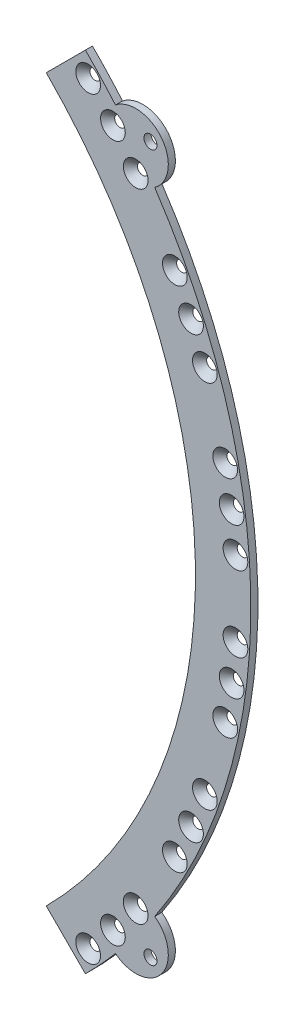
ISO-10303-21;
HEADER;
FILE_DESCRIPTION(('STEP AP214'),'2;1');
FILE_NAME('part.step','',(''),(''),'','','');
FILE_SCHEMA(('AUTOMOTIVE_DESIGN { 1 0 10303 214 1 1 1 1 }'));
ENDSEC;
DATA;
#1=APPLICATION_CONTEXT('core data for automotive mechanical design processes');
#2=APPLICATION_PROTOCOL_DEFINITION('international standard','automotive_design',2000,#1);
#3=PRODUCT_CONTEXT('',#1,'mechanical');
#4=PRODUCT('Part','Part','',(#3));
#5=PRODUCT_RELATED_PRODUCT_CATEGORY('part','',(#4));
#6=PRODUCT_DEFINITION_FORMATION('','',#4);
#7=PRODUCT_DEFINITION_CONTEXT('part definition',#1,'design');
#8=PRODUCT_DEFINITION('design','',#6,#7);
#9=PRODUCT_DEFINITION_SHAPE('','',#8);
#10=(LENGTH_UNIT() NAMED_UNIT(*) SI_UNIT(.MILLI.,.METRE.));
#11=(NAMED_UNIT(*) PLANE_ANGLE_UNIT() SI_UNIT($,.RADIAN.));
#12=(NAMED_UNIT(*) SI_UNIT($,.STERADIAN.) SOLID_ANGLE_UNIT());
#13=UNCERTAINTY_MEASURE_WITH_UNIT(LENGTH_MEASURE(1.E-05),#10,'distance_accuracy_value','');
#14=(GEOMETRIC_REPRESENTATION_CONTEXT(3) GLOBAL_UNCERTAINTY_ASSIGNED_CONTEXT((#13)) GLOBAL_UNIT_ASSIGNED_CONTEXT((#10,
#11,#12)) REPRESENTATION_CONTEXT('',''));
#15=CARTESIAN_POINT('',(0.,0.,0.));
#16=DIRECTION('',(0.,0.,1.));
#17=DIRECTION('',(1.,0.,0.));
#18=AXIS2_PLACEMENT_3D('',#15,#16,#17);
#19=CARTESIAN_POINT('',(0.,0.,2.));
#20=DIRECTION('',(0.,0.,-1.));
#21=DIRECTION('',(-1.,0.,0.));
#22=AXIS2_PLACEMENT_3D('',#19,#20,#21);
#23=PLANE('',#22);
#24=CARTESIAN_POINT('',(131.954619136931,-100.064346357229,2.));
#25=DIRECTION('',(0.,0.,-1.));
#26=DIRECTION('',(-1.,0.,0.));
#27=AXIS2_PLACEMENT_3D('',#24,#25,#26);
#28=CIRCLE('',#27,1.85000000000001);
#29=CARTESIAN_POINT('',(130.104619136931,-100.064346357229,2.));
#30=VERTEX_POINT('',#29);
#31=EDGE_CURVE('E235',#30,#30,#28,.T.);
#32=ORIENTED_EDGE('',*,*,#31,.T.);
#33=EDGE_LOOP('',(#32));
#34=FACE_BOUND('',#33,.T.);
#35=CARTESIAN_POINT('',(131.95461913693,100.064346357227,2.));
#36=DIRECTION('',(0.,0.,-1.));
#37=DIRECTION('',(-1.,0.,0.));
#38=AXIS2_PLACEMENT_3D('',#35,#36,#37);
#39=CIRCLE('',#38,1.85);
#40=CARTESIAN_POINT('',(130.10461913693,100.064346357227,2.));
#41=VERTEX_POINT('',#40);
#42=EDGE_CURVE('E599',#41,#41,#39,.T.);
#43=ORIENTED_EDGE('',*,*,#42,.T.);
#44=EDGE_LOOP('',(#43));
#45=FACE_BOUND('',#44,.T.);
#46=CARTESIAN_POINT('',(114.302744813103,-106.751311599393,2.));
#47=DIRECTION('',(0.,0.,-1.));
#48=DIRECTION('',(-1.,0.,0.));
#49=AXIS2_PLACEMENT_3D('',#46,#47,#48);
#50=CIRCLE('',#49,3.49999999998619);
#51=CARTESIAN_POINT('',(110.802744813116,-106.751311599393,2.));
#52=VERTEX_POINT('',#51);
#53=EDGE_CURVE('E11',#52,#52,#50,.T.);
#54=ORIENTED_EDGE('',*,*,#53,.T.);
#55=EDGE_LOOP('',(#54));
#56=FACE_BOUND('',#55,.T.);
#57=CARTESIAN_POINT('',(121.321245866172,-98.702154492594,2.));
#58=DIRECTION('',(0.,0.,-1.));
#59=DIRECTION('',(-1.,0.,0.));
#60=AXIS2_PLACEMENT_3D('',#57,#58,#59);
#61=CIRCLE('',#60,3.5);
#62=CARTESIAN_POINT('',(117.821245866172,-98.702154492594,2.));
#63=VERTEX_POINT('',#62);
#64=EDGE_CURVE('E41',#63,#63,#61,.T.);
#65=ORIENTED_EDGE('',*,*,#64,.T.);
#66=EDGE_LOOP('',(#65));
#67=FACE_BOUND('',#66,.T.);
#68=CARTESIAN_POINT('',(127.774091266831,-90.1928023787678,2.));
#69=DIRECTION('',(0.,0.,-1.));
#70=DIRECTION('',(-1.,0.,0.));
#71=AXIS2_PLACEMENT_3D('',#68,#69,#70);
#72=CIRCLE('',#71,3.50000000000325);
#73=CARTESIAN_POINT('',(124.274091266828,-90.1928023787678,2.));
#74=VERTEX_POINT('',#73);
#75=EDGE_CURVE('E185',#74,#74,#72,.T.);
#76=ORIENTED_EDGE('',*,*,#75,.T.);
#77=EDGE_LOOP('',(#76));
#78=FACE_BOUND('',#77,.T.);
#79=CARTESIAN_POINT('',(138.865248158134,-71.9541719011468,2.));
#80=DIRECTION('',(0.,0.,-1.));
#81=DIRECTION('',(-1.,0.,0.));
#82=AXIS2_PLACEMENT_3D('',#79,#80,#81);
#83=CIRCLE('',#82,3.4999999999889);
#84=CARTESIAN_POINT('',(135.365248158145,-71.9541719011468,2.));
#85=VERTEX_POINT('',#84);
#86=EDGE_CURVE('E182',#85,#85,#83,.T.);
#87=ORIENTED_EDGE('',*,*,#86,.T.);
#88=EDGE_LOOP('',(#87));
#89=FACE_BOUND('',#88,.T.);
#90=CARTESIAN_POINT('',(143.451847555453,-62.3099304519513,2.));
#91=DIRECTION('',(0.,0.,-1.));
#92=DIRECTION('',(-1.,0.,0.));
#93=AXIS2_PLACEMENT_3D('',#90,#91,#92);
#94=CIRCLE('',#93,3.5);
#95=CARTESIAN_POINT('',(139.951847555453,-62.3099304519513,2.));
#96=VERTEX_POINT('',#95);
#97=EDGE_CURVE('E179',#96,#96,#94,.T.);
#98=ORIENTED_EDGE('',*,*,#97,.T.);
#99=EDGE_LOOP('',(#98));
#100=FACE_BOUND('',#99,.T.);
#101=CARTESIAN_POINT('',(147.369608219383,-52.3751713435451,2.));
#102=DIRECTION('',(0.,0.,-1.));
#103=DIRECTION('',(-1.,0.,0.));
#104=AXIS2_PLACEMENT_3D('',#101,#102,#103);
#105=CIRCLE('',#104,3.5000000000025);
#106=CARTESIAN_POINT('',(143.86960821938,-52.3751713435451,2.));
#107=VERTEX_POINT('',#106);
#108=EDGE_CURVE('E176',#107,#107,#105,.T.);
#109=ORIENTED_EDGE('',*,*,#108,.T.);
#110=EDGE_LOOP('',(#109));
#111=FACE_BOUND('',#110,.T.);
#112=CARTESIAN_POINT('',(153.128751313515,-31.8205204414349,2.));
#113=DIRECTION('',(0.,0.,-1.));
#114=DIRECTION('',(-1.,0.,0.));
#115=AXIS2_PLACEMENT_3D('',#112,#113,#114);
#116=CIRCLE('',#115,3.50000000000203);
#117=CARTESIAN_POINT('',(149.628751313513,-31.8205204414349,2.));
#118=VERTEX_POINT('',#117);
#119=EDGE_CURVE('E173',#118,#118,#116,.T.);
#120=ORIENTED_EDGE('',*,*,#119,.T.);
#121=EDGE_LOOP('',(#120));
#122=FACE_BOUND('',#121,.T.);
#123=CARTESIAN_POINT('',(154.943281960082,-21.296463918652,2.));
#124=DIRECTION('',(0.,0.,-1.));
#125=DIRECTION('',(-1.,0.,0.));
#126=AXIS2_PLACEMENT_3D('',#123,#124,#125);
#127=CIRCLE('',#126,3.5);
#128=CARTESIAN_POINT('',(151.443281960082,-21.296463918652,2.));
#129=VERTEX_POINT('',#128);
#130=EDGE_CURVE('E170',#129,#129,#127,.T.);
#131=ORIENTED_EDGE('',*,*,#130,.T.);
#132=EDGE_LOOP('',(#131));
#133=FACE_BOUND('',#132,.T.);
#134=CARTESIAN_POINT('',(156.0353955014,-10.6731134502375,2.));
#135=DIRECTION('',(0.,0.,-1.));
#136=DIRECTION('',(-1.,0.,0.));
#137=AXIS2_PLACEMENT_3D('',#134,#135,#136);
#138=CIRCLE('',#137,3.50000000000156);
#139=CARTESIAN_POINT('',(152.535395501399,-10.6731134502375,2.));
#140=VERTEX_POINT('',#139);
#141=EDGE_CURVE('E167',#140,#140,#138,.T.);
#142=ORIENTED_EDGE('',*,*,#141,.T.);
#143=EDGE_LOOP('',(#142));
#144=FACE_BOUND('',#143,.T.);
#145=CARTESIAN_POINT('',(156.035395501401,10.6731134502307,2.));
#146=DIRECTION('',(0.,0.,-1.));
#147=DIRECTION('',(-1.,0.,0.));
#148=AXIS2_PLACEMENT_3D('',#145,#146,#147);
#149=CIRCLE('',#148,3.50000000000014);
#150=CARTESIAN_POINT('',(152.5353955014,10.6731134502307,2.));
#151=VERTEX_POINT('',#150);
#152=EDGE_CURVE('E164',#151,#151,#149,.T.);
#153=ORIENTED_EDGE('',*,*,#152,.T.);
#154=EDGE_LOOP('',(#153));
#155=FACE_BOUND('',#154,.T.);
#156=CARTESIAN_POINT('',(154.943281960082,21.2964639186541,2.));
#157=DIRECTION('',(0.,0.,-1.));
#158=DIRECTION('',(-1.,0.,0.));
#159=AXIS2_PLACEMENT_3D('',#156,#157,#158);
#160=CIRCLE('',#159,3.5);
#161=CARTESIAN_POINT('',(151.443281960082,21.2964639186541,2.));
#162=VERTEX_POINT('',#161);
#163=EDGE_CURVE('E161',#162,#162,#160,.T.);
#164=ORIENTED_EDGE('',*,*,#163,.T.);
#165=EDGE_LOOP('',(#164));
#166=FACE_BOUND('',#165,.T.);
#167=CARTESIAN_POINT('',(153.128751313516,31.8205204414281,2.));
#168=DIRECTION('',(0.,0.,-1.));
#169=DIRECTION('',(-1.,0.,0.));
#170=AXIS2_PLACEMENT_3D('',#167,#168,#169);
#171=CIRCLE('',#170,3.49999999999998);
#172=CARTESIAN_POINT('',(149.628751313516,31.8205204414281,2.));
#173=VERTEX_POINT('',#172);
#174=EDGE_CURVE('E158',#173,#173,#171,.T.);
#175=ORIENTED_EDGE('',*,*,#174,.T.);
#176=EDGE_LOOP('',(#175));
#177=FACE_BOUND('',#176,.T.);
#178=CARTESIAN_POINT('',(147.369608219384,52.3751713435407,2.));
#179=DIRECTION('',(0.,0.,-1.));
#180=DIRECTION('',(-1.,0.,0.));
#181=AXIS2_PLACEMENT_3D('',#178,#179,#180);
#182=CIRCLE('',#181,3.50000000000006);
#183=CARTESIAN_POINT('',(143.869608219384,52.3751713435407,2.));
#184=VERTEX_POINT('',#183);
#185=EDGE_CURVE('E155',#184,#184,#182,.T.);
#186=ORIENTED_EDGE('',*,*,#185,.T.);
#187=EDGE_LOOP('',(#186));
#188=FACE_BOUND('',#187,.T.);
#189=CARTESIAN_POINT('',(143.451847555452,62.3099304519534,2.));
#190=DIRECTION('',(0.,0.,-1.));
#191=DIRECTION('',(-1.,0.,0.));
#192=AXIS2_PLACEMENT_3D('',#189,#190,#191);
#193=CIRCLE('',#192,3.49999999999998);
#194=CARTESIAN_POINT('',(139.951847555452,62.3099304519534,2.));
#195=VERTEX_POINT('',#194);
#196=EDGE_CURVE('E152',#195,#195,#193,.T.);
#197=ORIENTED_EDGE('',*,*,#196,.T.);
#198=EDGE_LOOP('',(#197));
#199=FACE_BOUND('',#198,.T.);
#200=CARTESIAN_POINT('',(138.865248158133,71.9541719011488,2.));
#201=DIRECTION('',(0.,0.,-1.));
#202=DIRECTION('',(-1.,0.,0.));
#203=AXIS2_PLACEMENT_3D('',#200,#201,#202);
#204=CIRCLE('',#203,3.5);
#205=CARTESIAN_POINT('',(135.365248158133,71.9541719011488,2.));
#206=VERTEX_POINT('',#205);
#207=EDGE_CURVE('E149',#206,#206,#204,.T.);
#208=ORIENTED_EDGE('',*,*,#207,.T.);
#209=EDGE_LOOP('',(#208));
#210=FACE_BOUND('',#209,.T.);
#211=CARTESIAN_POINT('',(127.774091266834,90.1928023787642,2.));
#212=DIRECTION('',(0.,0.,-1.));
#213=DIRECTION('',(-1.,0.,0.));
#214=AXIS2_PLACEMENT_3D('',#211,#212,#213);
#215=CIRCLE('',#214,3.50000000000042);
#216=CARTESIAN_POINT('',(124.274091266834,90.1928023787642,2.));
#217=VERTEX_POINT('',#216);
#218=EDGE_CURVE('E146',#217,#217,#215,.T.);
#219=ORIENTED_EDGE('',*,*,#218,.T.);
#220=EDGE_LOOP('',(#219));
#221=FACE_BOUND('',#220,.T.);
#222=CARTESIAN_POINT('',(121.32124586617,98.7021544925957,2.));
#223=DIRECTION('',(0.,0.,-1.));
#224=DIRECTION('',(-1.,0.,0.));
#225=AXIS2_PLACEMENT_3D('',#222,#223,#224);
#226=CIRCLE('',#225,3.5);
#227=CARTESIAN_POINT('',(117.82124586617,98.7021544925957,2.));
#228=VERTEX_POINT('',#227);
#229=EDGE_CURVE('E143',#228,#228,#226,.T.);
#230=ORIENTED_EDGE('',*,*,#229,.T.);
#231=EDGE_LOOP('',(#230));
#232=FACE_BOUND('',#231,.T.);
#233=CARTESIAN_POINT('',(114.302744813101,106.751311599395,2.));
#234=DIRECTION('',(0.,0.,-1.));
#235=DIRECTION('',(-1.,0.,0.));
#236=AXIS2_PLACEMENT_3D('',#233,#234,#235);
#237=CIRCLE('',#236,3.49999999999304);
#238=CARTESIAN_POINT('',(110.802744813108,106.751311599395,2.));
#239=VERTEX_POINT('',#238);
#240=EDGE_CURVE('E140',#239,#239,#237,.T.);
#241=ORIENTED_EDGE('',*,*,#240,.T.);
#242=EDGE_LOOP('',(#241));
#243=FACE_BOUND('',#242,.T.);
#244=CARTESIAN_POINT('',(0.,0.,2.));
#245=DIRECTION('',(0.,0.,1.));
#246=DIRECTION('',(-1.,0.,0.));
#247=AXIS2_PLACEMENT_3D('',#244,#245,#246);
#248=CIRCLE('',#247,160.4);
#249=CARTESIAN_POINT('',(113.525944125029,-113.313812090675,2.));
#250=VERTEX_POINT('',#249);
#251=CARTESIAN_POINT('',(122.037613506745,-104.091214276606,2.));
#252=VERTEX_POINT('',#251);
#253=EDGE_CURVE('E113',#250,#252,#248,.T.);
#254=ORIENTED_EDGE('',*,*,#253,.T.);
#255=CARTESIAN_POINT('',(127.80753987111,-96.9195168791845,2.));
#256=DIRECTION('',(0.,0.,1.));
#257=DIRECTION('',(1.,0.,0.));
#258=AXIS2_PLACEMENT_3D('',#255,#256,#257);
#259=CIRCLE('',#258,9.2046343659254);
#260=CARTESIAN_POINT('',(133.156583771795,-89.428654234674,2.));
#261=VERTEX_POINT('',#260);
#262=EDGE_CURVE('E56',#252,#261,#259,.T.);
#263=ORIENTED_EDGE('',*,*,#262,.T.);
#264=CARTESIAN_POINT('',(133.156583771796,89.4286542346724,2.));
#265=VERTEX_POINT('',#264);
#266=EDGE_CURVE('E110',#261,#265,#248,.T.);
#267=ORIENTED_EDGE('',*,*,#266,.T.);
#268=CARTESIAN_POINT('',(127.807539871111,96.9195168791836,2.));
#269=DIRECTION('',(0.,0.,1.));
#270=DIRECTION('',(1.,0.,0.));
#271=AXIS2_PLACEMENT_3D('',#268,#269,#270);
#272=CIRCLE('',#271,9.20463436592635);
#273=CARTESIAN_POINT('',(122.037613506745,104.091214276606,2.));
#274=VERTEX_POINT('',#273);
#275=EDGE_CURVE('E48',#265,#274,#272,.T.);
#276=ORIENTED_EDGE('',*,*,#275,.T.);
#277=CARTESIAN_POINT('',(113.525944125031,113.313812090673,2.));
#278=VERTEX_POINT('',#277);
#279=EDGE_CURVE('E117',#274,#278,#248,.T.);
#280=ORIENTED_EDGE('',*,*,#279,.T.);
#281=DIRECTION('',(0.707106781186548,0.707106781186547,0.));
#282=VECTOR('',#281,1.);
#283=CARTESIAN_POINT('',(117.105903569723,116.893771535365,2.));
#284=LINE('',#283,#282);
#285=CARTESIAN_POINT('',(102.424362279382,102.212230245024,2.));
#286=VERTEX_POINT('',#285);
#287=EDGE_CURVE('E250',#286,#278,#284,.T.);
#288=ORIENTED_EDGE('',*,*,#287,.F.);
#289=CARTESIAN_POINT('',(0.,0.,2.));
#290=DIRECTION('',(0.,0.,-1.));
#291=DIRECTION('',(-1.,0.,0.));
#292=AXIS2_PLACEMENT_3D('',#289,#290,#291);
#293=CIRCLE('',#292,144.7);
#294=CARTESIAN_POINT('',(102.42436227938,-102.212230245026,2.));
#295=VERTEX_POINT('',#294);
#296=EDGE_CURVE('E119',#286,#295,#293,.T.);
#297=ORIENTED_EDGE('',*,*,#296,.T.);
#298=DIRECTION('',(-0.707106781186548,0.707106781186547,0.));
#299=VECTOR('',#298,1.);
#300=CARTESIAN_POINT('',(94.9530946684338,-94.7409626340794,2.));
#301=LINE('',#300,#299);
#302=EDGE_CURVE('E245',#250,#295,#301,.T.);
#303=ORIENTED_EDGE('',*,*,#302,.F.);
#304=EDGE_LOOP('',(#254,#263,#267,#276,#280,#288,#297,#303));
#305=FACE_BOUND('',#304,.T.);
#306=ADVANCED_FACE('F33',(#34,#45,#56,#67,#78,#89,#100,#111,#122,#133,#144,#155,#166,#177,#188,
#199,#210,#221,#232,#243,#305),#23,.F.);
#307=CARTESIAN_POINT('',(0.,0.,0.));
#308=DIRECTION('',(0.,0.,-1.));
#309=DIRECTION('',(-1.,0.,0.));
#310=AXIS2_PLACEMENT_3D('',#307,#308,#309);
#311=PLANE('',#310);
#312=CARTESIAN_POINT('',(131.954619136931,-100.064346357229,0.));
#313=DIRECTION('',(0.,0.,-1.));
#314=DIRECTION('',(-1.,0.,0.));
#315=AXIS2_PLACEMENT_3D('',#312,#313,#314);
#316=CIRCLE('',#315,1.85000000000001);
#317=CARTESIAN_POINT('',(130.104619136931,-100.064346357229,0.));
#318=VERTEX_POINT('',#317);
#319=EDGE_CURVE('E239',#318,#318,#316,.T.);
#320=ORIENTED_EDGE('',*,*,#319,.F.);
#321=EDGE_LOOP('',(#320));
#322=FACE_BOUND('',#321,.T.);
#323=CARTESIAN_POINT('',(131.95461913693,100.064346357227,0.));
#324=DIRECTION('',(0.,0.,-1.));
#325=DIRECTION('',(-1.,0.,0.));
#326=AXIS2_PLACEMENT_3D('',#323,#324,#325);
#327=CIRCLE('',#326,1.85);
#328=CARTESIAN_POINT('',(130.10461913693,100.064346357227,0.));
#329=VERTEX_POINT('',#328);
#330=EDGE_CURVE('E602',#329,#329,#327,.T.);
#331=ORIENTED_EDGE('',*,*,#330,.F.);
#332=EDGE_LOOP('',(#331));
#333=FACE_BOUND('',#332,.T.);
#334=CARTESIAN_POINT('',(138.865248158134,-71.9541719011468,0.));
#335=DIRECTION('',(0.,0.,1.));
#336=DIRECTION('',(1.,0.,0.));
#337=AXIS2_PLACEMENT_3D('',#334,#335,#336);
#338=CIRCLE('',#337,1.49999999998889);
#339=CARTESIAN_POINT('',(140.365248158123,-71.9541719011468,0.));
#340=VERTEX_POINT('',#339);
#341=EDGE_CURVE('E264',#340,#340,#338,.T.);
#342=ORIENTED_EDGE('',*,*,#341,.T.);
#343=EDGE_LOOP('',(#342));
#344=FACE_BOUND('',#343,.T.);
#345=CARTESIAN_POINT('',(114.302744813101,106.751311599395,0.));
#346=DIRECTION('',(0.,0.,1.));
#347=DIRECTION('',(1.,0.,0.));
#348=AXIS2_PLACEMENT_3D('',#345,#346,#347);
#349=CIRCLE('',#348,1.49999999999302);
#350=CARTESIAN_POINT('',(115.802744813094,106.751311599395,0.));
#351=VERTEX_POINT('',#350);
#352=EDGE_CURVE('E270',#351,#351,#349,.T.);
#353=ORIENTED_EDGE('',*,*,#352,.T.);
#354=EDGE_LOOP('',(#353));
#355=FACE_BOUND('',#354,.T.);
#356=CARTESIAN_POINT('',(153.128751313515,-31.8205204414349,0.));
#357=DIRECTION('',(0.,0.,1.));
#358=DIRECTION('',(-1.,0.,0.));
#359=AXIS2_PLACEMENT_3D('',#356,#357,#358);
#360=CIRCLE('',#359,1.50000000000204);
#361=CARTESIAN_POINT('',(151.628751313513,-31.8205204414349,0.));
#362=VERTEX_POINT('',#361);
#363=EDGE_CURVE('E276',#362,#362,#360,.T.);
#364=ORIENTED_EDGE('',*,*,#363,.T.);
#365=EDGE_LOOP('',(#364));
#366=FACE_BOUND('',#365,.T.);
#367=CARTESIAN_POINT('',(127.774091266831,-90.1928023787678,0.));
#368=DIRECTION('',(0.,0.,1.));
#369=DIRECTION('',(-1.,0.,0.));
#370=AXIS2_PLACEMENT_3D('',#367,#368,#369);
#371=CIRCLE('',#370,1.50000000000326);
#372=CARTESIAN_POINT('',(126.274091266828,-90.1928023787678,0.));
#373=VERTEX_POINT('',#372);
#374=EDGE_CURVE('E282',#373,#373,#371,.T.);
#375=ORIENTED_EDGE('',*,*,#374,.T.);
#376=EDGE_LOOP('',(#375));
#377=FACE_BOUND('',#376,.T.);
#378=CARTESIAN_POINT('',(153.128751313516,31.8205204414281,0.));
#379=DIRECTION('',(0.,0.,1.));
#380=DIRECTION('',(-1.,0.,0.));
#381=AXIS2_PLACEMENT_3D('',#378,#379,#380);
#382=CIRCLE('',#381,1.49999999999999);
#383=CARTESIAN_POINT('',(151.628751313516,31.8205204414281,0.));
#384=VERTEX_POINT('',#383);
#385=EDGE_CURVE('E288',#384,#384,#382,.T.);
#386=ORIENTED_EDGE('',*,*,#385,.T.);
#387=EDGE_LOOP('',(#386));
#388=FACE_BOUND('',#387,.T.);
#389=CARTESIAN_POINT('',(127.774091266834,90.1928023787642,0.));
#390=DIRECTION('',(0.,0.,1.));
#391=DIRECTION('',(-1.,0.,0.));
#392=AXIS2_PLACEMENT_3D('',#389,#390,#391);
#393=CIRCLE('',#392,1.50000000000042);
#394=CARTESIAN_POINT('',(126.274091266834,90.1928023787642,0.));
#395=VERTEX_POINT('',#394);
#396=EDGE_CURVE('E203',#395,#395,#393,.T.);
#397=ORIENTED_EDGE('',*,*,#396,.T.);
#398=EDGE_LOOP('',(#397));
#399=FACE_BOUND('',#398,.T.);
#400=CARTESIAN_POINT('',(143.451847555453,-62.3099304519513,0.));
#401=DIRECTION('',(0.,0.,1.));
#402=DIRECTION('',(1.,0.,0.));
#403=AXIS2_PLACEMENT_3D('',#400,#401,#402);
#404=CIRCLE('',#403,1.5);
#405=CARTESIAN_POINT('',(144.951847555453,-62.3099304519513,0.));
#406=VERTEX_POINT('',#405);
#407=EDGE_CURVE('E202',#406,#406,#404,.T.);
#408=ORIENTED_EDGE('',*,*,#407,.T.);
#409=EDGE_LOOP('',(#408));
#410=FACE_BOUND('',#409,.T.);
#411=CARTESIAN_POINT('',(154.943281960082,21.2964639186541,0.));
#412=DIRECTION('',(0.,0.,1.));
#413=DIRECTION('',(1.,0.,0.));
#414=AXIS2_PLACEMENT_3D('',#411,#412,#413);
#415=CIRCLE('',#414,1.5);
#416=CARTESIAN_POINT('',(156.443281960082,21.2964639186541,0.));
#417=VERTEX_POINT('',#416);
#418=EDGE_CURVE('E215',#417,#417,#415,.T.);
#419=ORIENTED_EDGE('',*,*,#418,.T.);
#420=EDGE_LOOP('',(#419));
#421=FACE_BOUND('',#420,.T.);
#422=CARTESIAN_POINT('',(121.32124586617,98.7021544925957,0.));
#423=DIRECTION('',(0.,0.,1.));
#424=DIRECTION('',(1.,0.,0.));
#425=AXIS2_PLACEMENT_3D('',#422,#423,#424);
#426=CIRCLE('',#425,1.5);
#427=CARTESIAN_POINT('',(122.82124586617,98.7021544925957,0.));
#428=VERTEX_POINT('',#427);
#429=EDGE_CURVE('E123',#428,#428,#426,.T.);
#430=ORIENTED_EDGE('',*,*,#429,.T.);
#431=EDGE_LOOP('',(#430));
#432=FACE_BOUND('',#431,.T.);
#433=CARTESIAN_POINT('',(143.451847555452,62.3099304519534,0.));
#434=DIRECTION('',(0.,0.,1.));
#435=DIRECTION('',(1.,0.,0.));
#436=AXIS2_PLACEMENT_3D('',#433,#434,#435);
#437=CIRCLE('',#436,1.5);
#438=CARTESIAN_POINT('',(144.951847555452,62.3099304519534,0.));
#439=VERTEX_POINT('',#438);
#440=EDGE_CURVE('E217',#439,#439,#437,.T.);
#441=ORIENTED_EDGE('',*,*,#440,.T.);
#442=EDGE_LOOP('',(#441));
#443=FACE_BOUND('',#442,.T.);
#444=CARTESIAN_POINT('',(154.943281960082,-21.296463918652,0.));
#445=DIRECTION('',(0.,0.,1.));
#446=DIRECTION('',(1.,0.,0.));
#447=AXIS2_PLACEMENT_3D('',#444,#445,#446);
#448=CIRCLE('',#447,1.5);
#449=CARTESIAN_POINT('',(156.443281960082,-21.296463918652,0.));
#450=VERTEX_POINT('',#449);
#451=EDGE_CURVE('E206',#450,#450,#448,.T.);
#452=ORIENTED_EDGE('',*,*,#451,.T.);
#453=EDGE_LOOP('',(#452));
#454=FACE_BOUND('',#453,.T.);
#455=CARTESIAN_POINT('',(121.321245866172,-98.702154492594,0.));
#456=DIRECTION('',(0.,0.,1.));
#457=DIRECTION('',(1.,0.,0.));
#458=AXIS2_PLACEMENT_3D('',#455,#456,#457);
#459=CIRCLE('',#458,1.5);
#460=CARTESIAN_POINT('',(122.821245866172,-98.702154492594,0.));
#461=VERTEX_POINT('',#460);
#462=EDGE_CURVE('E200',#461,#461,#459,.T.);
#463=ORIENTED_EDGE('',*,*,#462,.T.);
#464=EDGE_LOOP('',(#463));
#465=FACE_BOUND('',#464,.T.);
#466=CARTESIAN_POINT('',(147.369608219384,52.3751713435407,0.));
#467=DIRECTION('',(0.,0.,1.));
#468=DIRECTION('',(-1.,0.,0.));
#469=AXIS2_PLACEMENT_3D('',#466,#467,#468);
#470=CIRCLE('',#469,1.50000000000004);
#471=CARTESIAN_POINT('',(145.869608219384,52.3751713435407,0.));
#472=VERTEX_POINT('',#471);
#473=EDGE_CURVE('E209',#472,#472,#470,.T.);
#474=ORIENTED_EDGE('',*,*,#473,.T.);
#475=EDGE_LOOP('',(#474));
#476=FACE_BOUND('',#475,.T.);
#477=CARTESIAN_POINT('',(156.035395501401,10.6731134502307,0.));
#478=DIRECTION('',(0.,0.,1.));
#479=DIRECTION('',(-1.,0.,0.));
#480=AXIS2_PLACEMENT_3D('',#477,#478,#479);
#481=CIRCLE('',#480,1.50000000000013);
#482=CARTESIAN_POINT('',(154.535395501401,10.6731134502307,0.));
#483=VERTEX_POINT('',#482);
#484=EDGE_CURVE('E285',#483,#483,#481,.T.);
#485=ORIENTED_EDGE('',*,*,#484,.T.);
#486=EDGE_LOOP('',(#485));
#487=FACE_BOUND('',#486,.T.);
#488=CARTESIAN_POINT('',(147.369608219383,-52.3751713435451,0.));
#489=DIRECTION('',(0.,0.,1.));
#490=DIRECTION('',(-1.,0.,0.));
#491=AXIS2_PLACEMENT_3D('',#488,#489,#490);
#492=CIRCLE('',#491,1.50000000000247);
#493=CARTESIAN_POINT('',(145.86960821938,-52.3751713435451,0.));
#494=VERTEX_POINT('',#493);
#495=EDGE_CURVE('E279',#494,#494,#492,.T.);
#496=ORIENTED_EDGE('',*,*,#495,.T.);
#497=EDGE_LOOP('',(#496));
#498=FACE_BOUND('',#497,.T.);
#499=CARTESIAN_POINT('',(156.0353955014,-10.6731134502375,0.));
#500=DIRECTION('',(0.,0.,1.));
#501=DIRECTION('',(-1.,0.,0.));
#502=AXIS2_PLACEMENT_3D('',#499,#500,#501);
#503=CIRCLE('',#502,1.50000000000151);
#504=CARTESIAN_POINT('',(154.535395501399,-10.6731134502375,0.));
#505=VERTEX_POINT('',#504);
#506=EDGE_CURVE('E273',#505,#505,#503,.T.);
#507=ORIENTED_EDGE('',*,*,#506,.T.);
#508=EDGE_LOOP('',(#507));
#509=FACE_BOUND('',#508,.T.);
#510=CARTESIAN_POINT('',(138.865248158133,71.9541719011488,0.));
#511=DIRECTION('',(0.,0.,1.));
#512=DIRECTION('',(1.,0.,0.));
#513=AXIS2_PLACEMENT_3D('',#510,#511,#512);
#514=CIRCLE('',#513,1.5);
#515=CARTESIAN_POINT('',(140.365248158133,71.9541719011488,0.));
#516=VERTEX_POINT('',#515);
#517=EDGE_CURVE('E267',#516,#516,#514,.T.);
#518=ORIENTED_EDGE('',*,*,#517,.T.);
#519=EDGE_LOOP('',(#518));
#520=FACE_BOUND('',#519,.T.);
#521=CARTESIAN_POINT('',(114.302744813103,-106.751311599393,0.));
#522=DIRECTION('',(0.,0.,1.));
#523=DIRECTION('',(1.,0.,0.));
#524=AXIS2_PLACEMENT_3D('',#521,#522,#523);
#525=CIRCLE('',#524,1.49999999998617);
#526=CARTESIAN_POINT('',(115.802744813089,-106.751311599393,0.));
#527=VERTEX_POINT('',#526);
#528=EDGE_CURVE('E261',#527,#527,#525,.T.);
#529=ORIENTED_EDGE('',*,*,#528,.T.);
#530=EDGE_LOOP('',(#529));
#531=FACE_BOUND('',#530,.T.);
#532=CARTESIAN_POINT('',(127.80753987111,-96.9195168791845,0.));
#533=DIRECTION('',(0.,0.,1.));
#534=DIRECTION('',(1.,0.,0.));
#535=AXIS2_PLACEMENT_3D('',#532,#533,#534);
#536=CIRCLE('',#535,9.2046343659254);
#537=CARTESIAN_POINT('',(122.037613506745,-104.091214276606,0.));
#538=VERTEX_POINT('',#537);
#539=CARTESIAN_POINT('',(133.156583771795,-89.428654234674,0.));
#540=VERTEX_POINT('',#539);
#541=EDGE_CURVE('E99',#538,#540,#536,.T.);
#542=ORIENTED_EDGE('',*,*,#541,.F.);
#543=CARTESIAN_POINT('',(0.,0.,0.));
#544=DIRECTION('',(0.,0.,1.));
#545=DIRECTION('',(-1.,0.,0.));
#546=AXIS2_PLACEMENT_3D('',#543,#544,#545);
#547=CIRCLE('',#546,160.4);
#548=CARTESIAN_POINT('',(113.525944125029,-113.313812090675,0.));
#549=VERTEX_POINT('',#548);
#550=EDGE_CURVE('E128',#549,#538,#547,.T.);
#551=ORIENTED_EDGE('',*,*,#550,.F.);
#552=DIRECTION('',(-0.707106781186548,0.707106781186547,0.));
#553=VECTOR('',#552,1.);
#554=CARTESIAN_POINT('',(94.9530946684338,-94.7409626340794,0.));
#555=LINE('',#554,#553);
#556=CARTESIAN_POINT('',(102.42436227938,-102.212230245026,0.));
#557=VERTEX_POINT('',#556);
#558=EDGE_CURVE('E253',#549,#557,#555,.T.);
#559=ORIENTED_EDGE('',*,*,#558,.T.);
#560=CARTESIAN_POINT('',(0.,0.,0.));
#561=DIRECTION('',(0.,0.,-1.));
#562=DIRECTION('',(-1.,0.,0.));
#563=AXIS2_PLACEMENT_3D('',#560,#561,#562);
#564=CIRCLE('',#563,144.7);
#565=CARTESIAN_POINT('',(102.424362279382,102.212230245024,0.));
#566=VERTEX_POINT('',#565);
#567=EDGE_CURVE('E120',#566,#557,#564,.T.);
#568=ORIENTED_EDGE('',*,*,#567,.F.);
#569=DIRECTION('',(0.707106781186548,0.707106781186547,0.));
#570=VECTOR('',#569,1.);
#571=CARTESIAN_POINT('',(117.105903569723,116.893771535365,0.));
#572=LINE('',#571,#570);
#573=CARTESIAN_POINT('',(113.525944125031,113.313812090673,0.));
#574=VERTEX_POINT('',#573);
#575=EDGE_CURVE('E247',#566,#574,#572,.T.);
#576=ORIENTED_EDGE('',*,*,#575,.T.);
#577=CARTESIAN_POINT('',(122.037613506745,104.091214276606,0.));
#578=VERTEX_POINT('',#577);
#579=EDGE_CURVE('E132',#578,#574,#547,.T.);
#580=ORIENTED_EDGE('',*,*,#579,.F.);
#581=CARTESIAN_POINT('',(127.807539871111,96.9195168791836,0.));
#582=DIRECTION('',(0.,0.,1.));
#583=DIRECTION('',(1.,0.,0.));
#584=AXIS2_PLACEMENT_3D('',#581,#582,#583);
#585=CIRCLE('',#584,9.20463436592635);
#586=CARTESIAN_POINT('',(133.156583771796,89.4286542346724,0.));
#587=VERTEX_POINT('',#586);
#588=EDGE_CURVE('E233',#587,#578,#585,.T.);
#589=ORIENTED_EDGE('',*,*,#588,.F.);
#590=EDGE_CURVE('E131',#540,#587,#547,.T.);
#591=ORIENTED_EDGE('',*,*,#590,.F.);
#592=EDGE_LOOP('',(#542,#551,#559,#568,#576,#580,#589,#591));
#593=FACE_BOUND('',#592,.T.);
#594=ADVANCED_FACE('F231',(#322,#333,#344,#355,#366,#377,#388,#399,#410,#421,#432,#443,#454,
#465,#476,#487,#498,#509,#520,#531,#593),#311,.T.);
#595=CARTESIAN_POINT('',(0.,0.,2.));
#596=DIRECTION('',(0.,0.,-1.));
#597=DIRECTION('',(-1.,0.,0.));
#598=AXIS2_PLACEMENT_3D('',#595,#596,#597);
#599=CYLINDRICAL_SURFACE('',#598,160.4);
#600=ORIENTED_EDGE('',*,*,#590,.T.);
#601=DIRECTION('',(0.,0.,-1.));
#602=VECTOR('',#601,1.);
#603=CARTESIAN_POINT('',(133.156583771796,89.4286542346724,2.));
#604=LINE('',#603,#602);
#605=EDGE_CURVE('E105',#265,#587,#604,.T.);
#606=ORIENTED_EDGE('',*,*,#605,.F.);
#607=ORIENTED_EDGE('',*,*,#266,.F.);
#608=DIRECTION('',(0.,0.,-1.));
#609=VECTOR('',#608,1.);
#610=CARTESIAN_POINT('',(133.156583771795,-89.4286542346741,2.));
#611=LINE('',#610,#609);
#612=EDGE_CURVE('E96',#261,#540,#611,.T.);
#613=ORIENTED_EDGE('',*,*,#612,.T.);
#614=EDGE_LOOP('',(#600,#606,#607,#613));
#615=FACE_BOUND('',#614,.T.);
#616=ADVANCED_FACE('F116',(#615),#599,.T.);
#617=ORIENTED_EDGE('',*,*,#550,.T.);
#618=DIRECTION('',(0.,0.,-1.));
#619=VECTOR('',#618,1.);
#620=CARTESIAN_POINT('',(122.037613506745,-104.091214276606,2.));
#621=LINE('',#620,#619);
#622=EDGE_CURVE('E104',#252,#538,#621,.T.);
#623=ORIENTED_EDGE('',*,*,#622,.F.);
#624=ORIENTED_EDGE('',*,*,#253,.F.);
#625=DIRECTION('',(0.,0.,-1.));
#626=VECTOR('',#625,1.);
#627=CARTESIAN_POINT('',(113.525944125029,-113.313812090675,2.));
#628=LINE('',#627,#626);
#629=EDGE_CURVE('E249',#250,#549,#628,.T.);
#630=ORIENTED_EDGE('',*,*,#629,.T.);
#631=EDGE_LOOP('',(#617,#623,#624,#630));
#632=FACE_BOUND('',#631,.T.);
#633=ADVANCED_FACE('F333',(#632),#599,.T.);
#634=ORIENTED_EDGE('',*,*,#279,.F.);
#635=DIRECTION('',(0.,0.,-1.));
#636=VECTOR('',#635,1.);
#637=CARTESIAN_POINT('',(122.037613506745,104.091214276606,2.));
#638=LINE('',#637,#636);
#639=EDGE_CURVE('E114',#274,#578,#638,.T.);
#640=ORIENTED_EDGE('',*,*,#639,.T.);
#641=ORIENTED_EDGE('',*,*,#579,.T.);
#642=DIRECTION('',(0.,0.,-1.));
#643=VECTOR('',#642,1.);
#644=CARTESIAN_POINT('',(113.525944125031,113.313812090673,2.));
#645=LINE('',#644,#643);
#646=EDGE_CURVE('E259',#574,#278,#645,.F.);
#647=ORIENTED_EDGE('',*,*,#646,.T.);
#648=EDGE_LOOP('',(#634,#640,#641,#647));
#649=FACE_BOUND('',#648,.T.);
#650=ADVANCED_FACE('F329',(#649),#599,.T.);
#651=CARTESIAN_POINT('',(0.,0.,2.));
#652=DIRECTION('',(0.,0.,-1.));
#653=DIRECTION('',(-1.,0.,0.));
#654=AXIS2_PLACEMENT_3D('',#651,#652,#653);
#655=CYLINDRICAL_SURFACE('',#654,144.7);
#656=ORIENTED_EDGE('',*,*,#296,.F.);
#657=DIRECTION('',(0.,0.,-1.));
#658=VECTOR('',#657,1.);
#659=CARTESIAN_POINT('',(102.424362279382,102.212230245024,2.));
#660=LINE('',#659,#658);
#661=EDGE_CURVE('E137',#286,#566,#660,.T.);
#662=ORIENTED_EDGE('',*,*,#661,.T.);
#663=ORIENTED_EDGE('',*,*,#567,.T.);
#664=DIRECTION('',(0.,0.,-1.));
#665=VECTOR('',#664,1.);
#666=CARTESIAN_POINT('',(102.42436227938,-102.212230245026,2.));
#667=LINE('',#666,#665);
#668=EDGE_CURVE('E127',#557,#295,#667,.F.);
#669=ORIENTED_EDGE('',*,*,#668,.T.);
#670=EDGE_LOOP('',(#656,#662,#663,#669));
#671=FACE_BOUND('',#670,.T.);
#672=ADVANCED_FACE('F326',(#671),#655,.F.);
#673=CARTESIAN_POINT('',(94.9530946684338,-94.7409626340794,0.));
#674=DIRECTION('',(0.707106781186547,0.707106781186548,0.));
#675=DIRECTION('',(-0.707106781186548,0.707106781186547,0.));
#676=AXIS2_PLACEMENT_3D('',#673,#674,#675);
#677=PLANE('',#676);
#678=ORIENTED_EDGE('',*,*,#302,.T.);
#679=ORIENTED_EDGE('',*,*,#668,.F.);
#680=ORIENTED_EDGE('',*,*,#558,.F.);
#681=ORIENTED_EDGE('',*,*,#629,.F.);
#682=EDGE_LOOP('',(#678,#679,#680,#681));
#683=FACE_BOUND('',#682,.T.);
#684=ADVANCED_FACE('F323',(#683),#677,.F.);
#685=CARTESIAN_POINT('',(117.105903569723,116.893771535365,0.));
#686=DIRECTION('',(0.707106781186547,-0.707106781186548,0.));
#687=DIRECTION('',(0.707106781186548,0.707106781186547,0.));
#688=AXIS2_PLACEMENT_3D('',#685,#686,#687);
#689=PLANE('',#688);
#690=ORIENTED_EDGE('',*,*,#575,.F.);
#691=ORIENTED_EDGE('',*,*,#661,.F.);
#692=ORIENTED_EDGE('',*,*,#287,.T.);
#693=ORIENTED_EDGE('',*,*,#646,.F.);
#694=EDGE_LOOP('',(#690,#691,#692,#693));
#695=FACE_BOUND('',#694,.T.);
#696=ADVANCED_FACE('F335',(#695),#689,.F.);
#697=CARTESIAN_POINT('',(114.302744813103,-106.751311599393,0.));
#698=DIRECTION('',(0.,0.,1.));
#699=DIRECTION('',(1.,0.,0.));
#700=AXIS2_PLACEMENT_3D('',#697,#698,#699);
#701=CONICAL_SURFACE('',#700,1.49999999998617,0.785398163397457);
#702=ORIENTED_EDGE('',*,*,#53,.F.);
#703=EDGE_LOOP('',(#702));
#704=FACE_BOUND('',#703,.T.);
#705=ORIENTED_EDGE('',*,*,#528,.F.);
#706=EDGE_LOOP('',(#705));
#707=FACE_BOUND('',#706,.T.);
#708=ADVANCED_FACE('F196',(#704,#707),#701,.F.);
#709=CARTESIAN_POINT('',(121.321245866172,-98.702154492594,0.));
#710=DIRECTION('',(0.,0.,1.));
#711=DIRECTION('',(1.,0.,0.));
#712=AXIS2_PLACEMENT_3D('',#709,#710,#711);
#713=CONICAL_SURFACE('',#712,1.5,0.785398163397447);
#714=ORIENTED_EDGE('',*,*,#64,.F.);
#715=EDGE_LOOP('',(#714));
#716=FACE_BOUND('',#715,.T.);
#717=ORIENTED_EDGE('',*,*,#462,.F.);
#718=EDGE_LOOP('',(#717));
#719=FACE_BOUND('',#718,.T.);
#720=ADVANCED_FACE('F192',(#716,#719),#713,.F.);
#721=CARTESIAN_POINT('',(127.774091266831,-90.1928023787678,0.));
#722=DIRECTION('',(0.,0.,1.));
#723=DIRECTION('',(1.,0.,0.));
#724=AXIS2_PLACEMENT_3D('',#721,#722,#723);
#725=CONICAL_SURFACE('',#724,1.50000000000326,0.785398163397447);
#726=ORIENTED_EDGE('',*,*,#75,.F.);
#727=EDGE_LOOP('',(#726));
#728=FACE_BOUND('',#727,.T.);
#729=ORIENTED_EDGE('',*,*,#374,.F.);
#730=EDGE_LOOP('',(#729));
#731=FACE_BOUND('',#730,.T.);
#732=ADVANCED_FACE('F195',(#728,#731),#725,.F.);
#733=CARTESIAN_POINT('',(138.865248158134,-71.9541719011468,0.));
#734=DIRECTION('',(0.,0.,1.));
#735=DIRECTION('',(1.,0.,0.));
#736=AXIS2_PLACEMENT_3D('',#733,#734,#735);
#737=CONICAL_SURFACE('',#736,1.49999999998889,0.785398163397447);
#738=ORIENTED_EDGE('',*,*,#86,.F.);
#739=EDGE_LOOP('',(#738));
#740=FACE_BOUND('',#739,.T.);
#741=ORIENTED_EDGE('',*,*,#341,.F.);
#742=EDGE_LOOP('',(#741));
#743=FACE_BOUND('',#742,.T.);
#744=ADVANCED_FACE('F340',(#740,#743),#737,.F.);
#745=CARTESIAN_POINT('',(143.451847555453,-62.3099304519513,0.));
#746=DIRECTION('',(0.,0.,1.));
#747=DIRECTION('',(1.,0.,0.));
#748=AXIS2_PLACEMENT_3D('',#745,#746,#747);
#749=CONICAL_SURFACE('',#748,1.5,0.785398163397447);
#750=ORIENTED_EDGE('',*,*,#97,.F.);
#751=EDGE_LOOP('',(#750));
#752=FACE_BOUND('',#751,.T.);
#753=ORIENTED_EDGE('',*,*,#407,.F.);
#754=EDGE_LOOP('',(#753));
#755=FACE_BOUND('',#754,.T.);
#756=ADVANCED_FACE('F344',(#752,#755),#749,.F.);
#757=CARTESIAN_POINT('',(147.369608219383,-52.3751713435451,0.));
#758=DIRECTION('',(0.,0.,1.));
#759=DIRECTION('',(1.,0.,0.));
#760=AXIS2_PLACEMENT_3D('',#757,#758,#759);
#761=CONICAL_SURFACE('',#760,1.50000000000247,0.785398163397447);
#762=ORIENTED_EDGE('',*,*,#108,.F.);
#763=EDGE_LOOP('',(#762));
#764=FACE_BOUND('',#763,.T.);
#765=ORIENTED_EDGE('',*,*,#495,.F.);
#766=EDGE_LOOP('',(#765));
#767=FACE_BOUND('',#766,.T.);
#768=ADVANCED_FACE('F348',(#764,#767),#761,.F.);
#769=CARTESIAN_POINT('',(153.128751313515,-31.8205204414349,0.));
#770=DIRECTION('',(0.,0.,1.));
#771=DIRECTION('',(1.,0.,0.));
#772=AXIS2_PLACEMENT_3D('',#769,#770,#771);
#773=CONICAL_SURFACE('',#772,1.50000000000204,0.785398163397447);
#774=ORIENTED_EDGE('',*,*,#119,.F.);
#775=EDGE_LOOP('',(#774));
#776=FACE_BOUND('',#775,.T.);
#777=ORIENTED_EDGE('',*,*,#363,.F.);
#778=EDGE_LOOP('',(#777));
#779=FACE_BOUND('',#778,.T.);
#780=ADVANCED_FACE('F352',(#776,#779),#773,.F.);
#781=CARTESIAN_POINT('',(154.943281960082,-21.296463918652,0.));
#782=DIRECTION('',(0.,0.,1.));
#783=DIRECTION('',(1.,0.,0.));
#784=AXIS2_PLACEMENT_3D('',#781,#782,#783);
#785=CONICAL_SURFACE('',#784,1.5,0.785398163397447);
#786=ORIENTED_EDGE('',*,*,#130,.F.);
#787=EDGE_LOOP('',(#786));
#788=FACE_BOUND('',#787,.T.);
#789=ORIENTED_EDGE('',*,*,#451,.F.);
#790=EDGE_LOOP('',(#789));
#791=FACE_BOUND('',#790,.T.);
#792=ADVANCED_FACE('F356',(#788,#791),#785,.F.);
#793=CARTESIAN_POINT('',(156.0353955014,-10.6731134502375,0.));
#794=DIRECTION('',(0.,0.,1.));
#795=DIRECTION('',(1.,0.,0.));
#796=AXIS2_PLACEMENT_3D('',#793,#794,#795);
#797=CONICAL_SURFACE('',#796,1.50000000000151,0.785398163397447);
#798=ORIENTED_EDGE('',*,*,#141,.F.);
#799=EDGE_LOOP('',(#798));
#800=FACE_BOUND('',#799,.T.);
#801=ORIENTED_EDGE('',*,*,#506,.F.);
#802=EDGE_LOOP('',(#801));
#803=FACE_BOUND('',#802,.T.);
#804=ADVANCED_FACE('F360',(#800,#803),#797,.F.);
#805=CARTESIAN_POINT('',(156.035395501401,10.6731134502307,0.));
#806=DIRECTION('',(0.,0.,1.));
#807=DIRECTION('',(1.,0.,0.));
#808=AXIS2_PLACEMENT_3D('',#805,#806,#807);
#809=CONICAL_SURFACE('',#808,1.50000000000013,0.785398163397447);
#810=ORIENTED_EDGE('',*,*,#152,.F.);
#811=EDGE_LOOP('',(#810));
#812=FACE_BOUND('',#811,.T.);
#813=ORIENTED_EDGE('',*,*,#484,.F.);
#814=EDGE_LOOP('',(#813));
#815=FACE_BOUND('',#814,.T.);
#816=ADVANCED_FACE('F364',(#812,#815),#809,.F.);
#817=CARTESIAN_POINT('',(154.943281960082,21.2964639186541,0.));
#818=DIRECTION('',(0.,0.,1.));
#819=DIRECTION('',(1.,0.,0.));
#820=AXIS2_PLACEMENT_3D('',#817,#818,#819);
#821=CONICAL_SURFACE('',#820,1.5,0.785398163397447);
#822=ORIENTED_EDGE('',*,*,#163,.F.);
#823=EDGE_LOOP('',(#822));
#824=FACE_BOUND('',#823,.T.);
#825=ORIENTED_EDGE('',*,*,#418,.F.);
#826=EDGE_LOOP('',(#825));
#827=FACE_BOUND('',#826,.T.);
#828=ADVANCED_FACE('F308',(#824,#827),#821,.F.);
#829=CARTESIAN_POINT('',(153.128751313516,31.8205204414281,0.));
#830=DIRECTION('',(0.,0.,1.));
#831=DIRECTION('',(1.,0.,0.));
#832=AXIS2_PLACEMENT_3D('',#829,#830,#831);
#833=CONICAL_SURFACE('',#832,1.49999999999999,0.785398163397447);
#834=ORIENTED_EDGE('',*,*,#174,.F.);
#835=EDGE_LOOP('',(#834));
#836=FACE_BOUND('',#835,.T.);
#837=ORIENTED_EDGE('',*,*,#385,.F.);
#838=EDGE_LOOP('',(#837));
#839=FACE_BOUND('',#838,.T.);
#840=ADVANCED_FACE('F298',(#836,#839),#833,.F.);
#841=CARTESIAN_POINT('',(147.369608219384,52.3751713435407,0.));
#842=DIRECTION('',(0.,0.,1.));
#843=DIRECTION('',(1.,0.,0.));
#844=AXIS2_PLACEMENT_3D('',#841,#842,#843);
#845=CONICAL_SURFACE('',#844,1.50000000000004,0.785398163397447);
#846=ORIENTED_EDGE('',*,*,#185,.F.);
#847=EDGE_LOOP('',(#846));
#848=FACE_BOUND('',#847,.T.);
#849=ORIENTED_EDGE('',*,*,#473,.F.);
#850=EDGE_LOOP('',(#849));
#851=FACE_BOUND('',#850,.T.);
#852=ADVANCED_FACE('F295',(#848,#851),#845,.F.);
#853=CARTESIAN_POINT('',(143.451847555452,62.3099304519534,0.));
#854=DIRECTION('',(0.,0.,1.));
#855=DIRECTION('',(1.,0.,0.));
#856=AXIS2_PLACEMENT_3D('',#853,#854,#855);
#857=CONICAL_SURFACE('',#856,1.5,0.785398163397447);
#858=ORIENTED_EDGE('',*,*,#196,.F.);
#859=EDGE_LOOP('',(#858));
#860=FACE_BOUND('',#859,.T.);
#861=ORIENTED_EDGE('',*,*,#440,.F.);
#862=EDGE_LOOP('',(#861));
#863=FACE_BOUND('',#862,.T.);
#864=ADVANCED_FACE('F297',(#860,#863),#857,.F.);
#865=CARTESIAN_POINT('',(138.865248158133,71.9541719011488,0.));
#866=DIRECTION('',(0.,0.,1.));
#867=DIRECTION('',(1.,0.,0.));
#868=AXIS2_PLACEMENT_3D('',#865,#866,#867);
#869=CONICAL_SURFACE('',#868,1.5,0.785398163397447);
#870=ORIENTED_EDGE('',*,*,#207,.F.);
#871=EDGE_LOOP('',(#870));
#872=FACE_BOUND('',#871,.T.);
#873=ORIENTED_EDGE('',*,*,#517,.F.);
#874=EDGE_LOOP('',(#873));
#875=FACE_BOUND('',#874,.T.);
#876=ADVANCED_FACE('F305',(#872,#875),#869,.F.);
#877=CARTESIAN_POINT('',(127.774091266834,90.1928023787642,0.));
#878=DIRECTION('',(0.,0.,1.));
#879=DIRECTION('',(1.,0.,0.));
#880=AXIS2_PLACEMENT_3D('',#877,#878,#879);
#881=CONICAL_SURFACE('',#880,1.50000000000042,0.785398163397447);
#882=ORIENTED_EDGE('',*,*,#218,.F.);
#883=EDGE_LOOP('',(#882));
#884=FACE_BOUND('',#883,.T.);
#885=ORIENTED_EDGE('',*,*,#396,.F.);
#886=EDGE_LOOP('',(#885));
#887=FACE_BOUND('',#886,.T.);
#888=ADVANCED_FACE('F413',(#884,#887),#881,.F.);
#889=CARTESIAN_POINT('',(121.32124586617,98.7021544925957,0.));
#890=DIRECTION('',(0.,0.,1.));
#891=DIRECTION('',(1.,0.,0.));
#892=AXIS2_PLACEMENT_3D('',#889,#890,#891);
#893=CONICAL_SURFACE('',#892,1.5,0.785398163397447);
#894=ORIENTED_EDGE('',*,*,#229,.F.);
#895=EDGE_LOOP('',(#894));
#896=FACE_BOUND('',#895,.T.);
#897=ORIENTED_EDGE('',*,*,#429,.F.);
#898=EDGE_LOOP('',(#897));
#899=FACE_BOUND('',#898,.T.);
#900=ADVANCED_FACE('F398',(#896,#899),#893,.F.);
#901=CARTESIAN_POINT('',(114.302744813101,106.751311599395,0.));
#902=DIRECTION('',(0.,0.,1.));
#903=DIRECTION('',(1.,0.,0.));
#904=AXIS2_PLACEMENT_3D('',#901,#902,#903);
#905=CONICAL_SURFACE('',#904,1.49999999999302,0.785398163397447);
#906=ORIENTED_EDGE('',*,*,#240,.F.);
#907=EDGE_LOOP('',(#906));
#908=FACE_BOUND('',#907,.T.);
#909=ORIENTED_EDGE('',*,*,#352,.F.);
#910=EDGE_LOOP('',(#909));
#911=FACE_BOUND('',#910,.T.);
#912=ADVANCED_FACE('F35',(#908,#911),#905,.F.);
#913=CARTESIAN_POINT('',(127.807539871111,96.9195168791836,2.));
#914=DIRECTION('',(0.,0.,-1.));
#915=DIRECTION('',(-1.,0.,0.));
#916=AXIS2_PLACEMENT_3D('',#913,#914,#915);
#917=CYLINDRICAL_SURFACE('',#916,9.20463436592635);
#918=ORIENTED_EDGE('',*,*,#588,.T.);
#919=ORIENTED_EDGE('',*,*,#639,.F.);
#920=ORIENTED_EDGE('',*,*,#275,.F.);
#921=ORIENTED_EDGE('',*,*,#605,.T.);
#922=EDGE_LOOP('',(#918,#919,#920,#921));
#923=FACE_BOUND('',#922,.T.);
#924=ADVANCED_FACE('F397',(#923),#917,.T.);
#925=CARTESIAN_POINT('',(127.80753987111,-96.9195168791845,2.));
#926=DIRECTION('',(0.,0.,-1.));
#927=DIRECTION('',(-1.,0.,0.));
#928=AXIS2_PLACEMENT_3D('',#925,#926,#927);
#929=CYLINDRICAL_SURFACE('',#928,9.2046343659254);
#930=ORIENTED_EDGE('',*,*,#541,.T.);
#931=ORIENTED_EDGE('',*,*,#612,.F.);
#932=ORIENTED_EDGE('',*,*,#262,.F.);
#933=ORIENTED_EDGE('',*,*,#622,.T.);
#934=EDGE_LOOP('',(#930,#931,#932,#933));
#935=FACE_BOUND('',#934,.T.);
#936=ADVANCED_FACE('F97',(#935),#929,.T.);
#937=CARTESIAN_POINT('',(131.95461913693,100.064346357227,2.));
#938=DIRECTION('',(0.,0.,-1.));
#939=DIRECTION('',(-1.,0.,0.));
#940=AXIS2_PLACEMENT_3D('',#937,#938,#939);
#941=CYLINDRICAL_SURFACE('',#940,1.85);
#942=ORIENTED_EDGE('',*,*,#42,.F.);
#943=EDGE_LOOP('',(#942));
#944=FACE_BOUND('',#943,.T.);
#945=ORIENTED_EDGE('',*,*,#330,.T.);
#946=EDGE_LOOP('',(#945));
#947=FACE_BOUND('',#946,.T.);
#948=ADVANCED_FACE('F559',(#944,#947),#941,.F.);
#949=CARTESIAN_POINT('',(131.954619136931,-100.064346357229,2.));
#950=DIRECTION('',(0.,0.,-1.));
#951=DIRECTION('',(-1.,0.,0.));
#952=AXIS2_PLACEMENT_3D('',#949,#950,#951);
#953=CYLINDRICAL_SURFACE('',#952,1.85000000000001);
#954=ORIENTED_EDGE('',*,*,#31,.F.);
#955=EDGE_LOOP('',(#954));
#956=FACE_BOUND('',#955,.T.);
#957=ORIENTED_EDGE('',*,*,#319,.T.);
#958=EDGE_LOOP('',(#957));
#959=FACE_BOUND('',#958,.T.);
#960=ADVANCED_FACE('F581',(#956,#959),#953,.F.);
#961=CLOSED_SHELL('',(#306,#594,#616,#633,#650,#672,#684,#696,#708,#720,#732,#744,#756,#768,
#780,#792,#804,#816,#828,#840,#852,#864,#876,#888,#900,#912,#924,#936,#948,#960));
#962=MANIFOLD_SOLID_BREP('B2',#961);
#963=ADVANCED_BREP_SHAPE_REPRESENTATION('',(#18,#962),#14);
#964=SHAPE_DEFINITION_REPRESENTATION(#9,#963);
ENDSEC;
END-ISO-10303-21;
